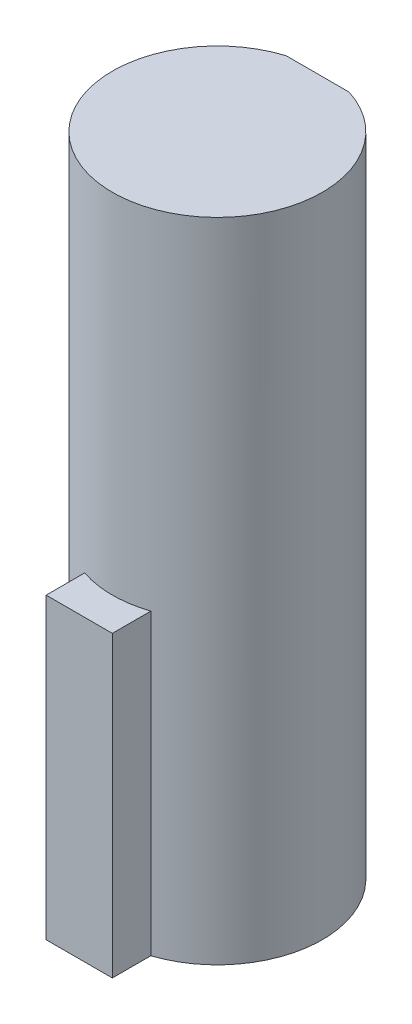
ISO-10303-21;
HEADER;
FILE_DESCRIPTION(('STEP AP214'),'2;1');
FILE_NAME('part.step','',(''),(''),'','','');
FILE_SCHEMA(('AUTOMOTIVE_DESIGN { 1 0 10303 214 1 1 1 1 }'));
ENDSEC;
DATA;
#1=APPLICATION_CONTEXT('core data for automotive mechanical design processes');
#2=APPLICATION_PROTOCOL_DEFINITION('international standard','automotive_design',2000,#1);
#3=PRODUCT_CONTEXT('',#1,'mechanical');
#4=PRODUCT('Part','Part','',(#3));
#5=PRODUCT_RELATED_PRODUCT_CATEGORY('part','',(#4));
#6=PRODUCT_DEFINITION_FORMATION('','',#4);
#7=PRODUCT_DEFINITION_CONTEXT('part definition',#1,'design');
#8=PRODUCT_DEFINITION('design','',#6,#7);
#9=PRODUCT_DEFINITION_SHAPE('','',#8);
#10=(LENGTH_UNIT() NAMED_UNIT(*) SI_UNIT(.MILLI.,.METRE.));
#11=(NAMED_UNIT(*) PLANE_ANGLE_UNIT() SI_UNIT($,.RADIAN.));
#12=(NAMED_UNIT(*) SI_UNIT($,.STERADIAN.) SOLID_ANGLE_UNIT());
#13=UNCERTAINTY_MEASURE_WITH_UNIT(LENGTH_MEASURE(1.E-05),#10,'distance_accuracy_value','');
#14=(GEOMETRIC_REPRESENTATION_CONTEXT(3) GLOBAL_UNCERTAINTY_ASSIGNED_CONTEXT((#13)) GLOBAL_UNIT_ASSIGNED_CONTEXT((#10,
#11,#12)) REPRESENTATION_CONTEXT('',''));
#15=CARTESIAN_POINT('',(0.,0.,0.));
#16=DIRECTION('',(0.,0.,1.));
#17=DIRECTION('',(1.,0.,0.));
#18=AXIS2_PLACEMENT_3D('',#15,#16,#17);
#19=CARTESIAN_POINT('',(2.3,20.75,0.));
#20=DIRECTION('',(1.,0.,0.));
#21=DIRECTION('',(0.,0.,-1.));
#22=AXIS2_PLACEMENT_3D('',#19,#20,#21);
#23=PLANE('',#22);
#24=DIRECTION('',(0.,0.,1.));
#25=VECTOR('',#24,1.);
#26=CARTESIAN_POINT('',(2.3,0.,0.));
#27=LINE('',#26,#25);
#28=CARTESIAN_POINT('',(2.3,0.,6.92820323027551));
#29=VERTEX_POINT('',#28);
#30=CARTESIAN_POINT('',(2.3,0.,9.60106781186547));
#31=VERTEX_POINT('',#30);
#32=EDGE_CURVE('E114',#29,#31,#27,.T.);
#33=ORIENTED_EDGE('',*,*,#32,.F.);
#34=DIRECTION('',(0.,-1.,0.));
#35=VECTOR('',#34,1.);
#36=CARTESIAN_POINT('',(2.3,20.75,6.92820323027551));
#37=LINE('',#36,#35);
#38=CARTESIAN_POINT('',(2.3,20.75,6.92820323027551));
#39=VERTEX_POINT('',#38);
#40=EDGE_CURVE('E121',#39,#29,#37,.T.);
#41=ORIENTED_EDGE('',*,*,#40,.F.);
#42=DIRECTION('',(0.,0.,1.));
#43=VECTOR('',#42,1.);
#44=CARTESIAN_POINT('',(2.3,20.75,0.));
#45=LINE('',#44,#43);
#46=CARTESIAN_POINT('',(2.3,20.75,9.60106781186547));
#47=VERTEX_POINT('',#46);
#48=EDGE_CURVE('E122',#39,#47,#45,.T.);
#49=ORIENTED_EDGE('',*,*,#48,.T.);
#50=DIRECTION('',(0.,-1.,0.));
#51=VECTOR('',#50,1.);
#52=CARTESIAN_POINT('',(2.3,20.75,9.60106781186547));
#53=LINE('',#52,#51);
#54=EDGE_CURVE('E65',#47,#31,#53,.T.);
#55=ORIENTED_EDGE('',*,*,#54,.T.);
#56=EDGE_LOOP('',(#33,#41,#49,#55));
#57=FACE_BOUND('',#56,.T.);
#58=ADVANCED_FACE('F43',(#57),#23,.T.);
#59=CARTESIAN_POINT('',(0.,20.75,0.));
#60=DIRECTION('',(0.,-1.,0.));
#61=DIRECTION('',(0.,0.,-1.));
#62=AXIS2_PLACEMENT_3D('',#59,#60,#61);
#63=CYLINDRICAL_SURFACE('',#62,7.3);
#64=CARTESIAN_POINT('',(0.,45.,0.));
#65=DIRECTION('',(0.,1.,0.));
#66=DIRECTION('',(0.,0.,1.));
#67=AXIS2_PLACEMENT_3D('',#64,#65,#66);
#68=CIRCLE('',#67,7.3);
#69=CARTESIAN_POINT('',(-2.18632111090755,45.,-6.96491205974634));
#70=VERTEX_POINT('',#69);
#71=CARTESIAN_POINT('',(2.18632111090755,45.,-6.96491205974634));
#72=VERTEX_POINT('',#71);
#73=EDGE_CURVE('E108',#70,#72,#68,.T.);
#74=ORIENTED_EDGE('',*,*,#73,.F.);
#75=DIRECTION('',(0.,-1.,0.));
#76=VECTOR('',#75,1.);
#77=CARTESIAN_POINT('',(-2.18632111090755,20.75,-6.96491205974634));
#78=LINE('',#77,#76);
#79=CARTESIAN_POINT('',(-2.18632111090755,0.,-6.96491205974634));
#80=VERTEX_POINT('',#79);
#81=EDGE_CURVE('E56',#70,#80,#78,.T.);
#82=ORIENTED_EDGE('',*,*,#81,.T.);
#83=CARTESIAN_POINT('',(0.,0.,0.));
#84=DIRECTION('',(0.,1.,0.));
#85=DIRECTION('',(0.,0.,1.));
#86=AXIS2_PLACEMENT_3D('',#83,#84,#85);
#87=CIRCLE('',#86,7.3);
#88=CARTESIAN_POINT('',(-2.30000000000001,0.,6.92820323027551));
#89=VERTEX_POINT('',#88);
#90=EDGE_CURVE('E116',#80,#89,#87,.T.);
#91=ORIENTED_EDGE('',*,*,#90,.T.);
#92=DIRECTION('',(0.,-1.,0.));
#93=VECTOR('',#92,1.);
#94=CARTESIAN_POINT('',(-2.30000000000001,20.75,6.92820323027551));
#95=LINE('',#94,#93);
#96=CARTESIAN_POINT('',(-2.30000000000001,20.75,6.92820323027551));
#97=VERTEX_POINT('',#96);
#98=EDGE_CURVE('E138',#97,#89,#95,.T.);
#99=ORIENTED_EDGE('',*,*,#98,.F.);
#100=CARTESIAN_POINT('',(0.,20.75,0.));
#101=DIRECTION('',(0.,1.,0.));
#102=DIRECTION('',(0.,0.,1.));
#103=AXIS2_PLACEMENT_3D('',#100,#101,#102);
#104=CIRCLE('',#103,7.3);
#105=EDGE_CURVE('E50',#97,#39,#104,.T.);
#106=ORIENTED_EDGE('',*,*,#105,.T.);
#107=ORIENTED_EDGE('',*,*,#40,.T.);
#108=CARTESIAN_POINT('',(2.18632111090755,0.,-6.96491205974634));
#109=VERTEX_POINT('',#108);
#110=EDGE_CURVE('E110',#29,#109,#87,.T.);
#111=ORIENTED_EDGE('',*,*,#110,.T.);
#112=DIRECTION('',(0.,-1.,0.));
#113=VECTOR('',#112,1.);
#114=CARTESIAN_POINT('',(2.18632111090755,20.75,-6.96491205974634));
#115=LINE('',#114,#113);
#116=EDGE_CURVE('E100',#109,#72,#115,.F.);
#117=ORIENTED_EDGE('',*,*,#116,.T.);
#118=EDGE_LOOP('',(#74,#82,#91,#99,#106,#107,#111,#117));
#119=FACE_BOUND('',#118,.T.);
#120=ADVANCED_FACE('F107',(#119),#63,.T.);
#121=CARTESIAN_POINT('',(-2.30000000000003,20.75,0.));
#122=DIRECTION('',(1.,0.,0.));
#123=DIRECTION('',(0.,0.,-1.));
#124=AXIS2_PLACEMENT_3D('',#121,#122,#123);
#125=PLANE('',#124);
#126=DIRECTION('',(0.,0.,1.));
#127=VECTOR('',#126,1.);
#128=CARTESIAN_POINT('',(-2.30000000000003,0.,0.));
#129=LINE('',#128,#127);
#130=CARTESIAN_POINT('',(-2.3,0.,9.60106781186547));
#131=VERTEX_POINT('',#130);
#132=EDGE_CURVE('E130',#89,#131,#129,.T.);
#133=ORIENTED_EDGE('',*,*,#132,.T.);
#134=DIRECTION('',(0.,-1.,0.));
#135=VECTOR('',#134,1.);
#136=CARTESIAN_POINT('',(-2.3,20.75,9.60106781186547));
#137=LINE('',#136,#135);
#138=CARTESIAN_POINT('',(-2.3,20.75,9.60106781186547));
#139=VERTEX_POINT('',#138);
#140=EDGE_CURVE('E136',#139,#131,#137,.T.);
#141=ORIENTED_EDGE('',*,*,#140,.F.);
#142=DIRECTION('',(0.,0.,1.));
#143=VECTOR('',#142,1.);
#144=CARTESIAN_POINT('',(-2.30000000000003,20.75,0.));
#145=LINE('',#144,#143);
#146=EDGE_CURVE('E124',#97,#139,#145,.T.);
#147=ORIENTED_EDGE('',*,*,#146,.F.);
#148=ORIENTED_EDGE('',*,*,#98,.T.);
#149=EDGE_LOOP('',(#133,#141,#147,#148));
#150=FACE_BOUND('',#149,.T.);
#151=ADVANCED_FACE('F149',(#150),#125,.F.);
#152=CARTESIAN_POINT('',(0.,20.75,9.60106781186547));
#153=DIRECTION('',(0.,0.,1.));
#154=DIRECTION('',(1.,0.,0.));
#155=AXIS2_PLACEMENT_3D('',#152,#153,#154);
#156=PLANE('',#155);
#157=DIRECTION('',(-1.,0.,0.));
#158=VECTOR('',#157,1.);
#159=CARTESIAN_POINT('',(0.,0.,9.60106781186547));
#160=LINE('',#159,#158);
#161=EDGE_CURVE('E125',#31,#131,#160,.T.);
#162=ORIENTED_EDGE('',*,*,#161,.F.);
#163=ORIENTED_EDGE('',*,*,#54,.F.);
#164=DIRECTION('',(-1.,0.,0.));
#165=VECTOR('',#164,1.);
#166=CARTESIAN_POINT('',(0.,20.75,9.60106781186547));
#167=LINE('',#166,#165);
#168=EDGE_CURVE('E127',#47,#139,#167,.T.);
#169=ORIENTED_EDGE('',*,*,#168,.T.);
#170=ORIENTED_EDGE('',*,*,#140,.T.);
#171=EDGE_LOOP('',(#162,#163,#169,#170));
#172=FACE_BOUND('',#171,.T.);
#173=ADVANCED_FACE('F155',(#172),#156,.T.);
#174=CARTESIAN_POINT('',(0.,20.75,0.));
#175=DIRECTION('',(0.,1.,0.));
#176=DIRECTION('',(0.,0.,1.));
#177=AXIS2_PLACEMENT_3D('',#174,#175,#176);
#178=PLANE('',#177);
#179=ORIENTED_EDGE('',*,*,#105,.F.);
#180=ORIENTED_EDGE('',*,*,#146,.T.);
#181=ORIENTED_EDGE('',*,*,#168,.F.);
#182=ORIENTED_EDGE('',*,*,#48,.F.);
#183=EDGE_LOOP('',(#179,#180,#181,#182));
#184=FACE_BOUND('',#183,.T.);
#185=ADVANCED_FACE('F160',(#184),#178,.T.);
#186=CARTESIAN_POINT('',(0.,0.,0.));
#187=DIRECTION('',(0.,1.,0.));
#188=DIRECTION('',(0.,0.,1.));
#189=AXIS2_PLACEMENT_3D('',#186,#187,#188);
#190=PLANE('',#189);
#191=ORIENTED_EDGE('',*,*,#90,.F.);
#192=DIRECTION('',(1.,0.,0.));
#193=VECTOR('',#192,1.);
#194=CARTESIAN_POINT('',(0.,0.,-6.96491205974634));
#195=LINE('',#194,#193);
#196=EDGE_CURVE('E111',#80,#109,#195,.T.);
#197=ORIENTED_EDGE('',*,*,#196,.T.);
#198=ORIENTED_EDGE('',*,*,#110,.F.);
#199=ORIENTED_EDGE('',*,*,#32,.T.);
#200=ORIENTED_EDGE('',*,*,#161,.T.);
#201=ORIENTED_EDGE('',*,*,#132,.F.);
#202=EDGE_LOOP('',(#191,#197,#198,#199,#200,#201));
#203=FACE_BOUND('',#202,.T.);
#204=ADVANCED_FACE('F143',(#203),#190,.F.);
#205=CARTESIAN_POINT('',(0.,45.,0.));
#206=DIRECTION('',(0.,1.,0.));
#207=DIRECTION('',(0.,0.,1.));
#208=AXIS2_PLACEMENT_3D('',#205,#206,#207);
#209=PLANE('',#208);
#210=DIRECTION('',(1.,0.,0.));
#211=VECTOR('',#210,1.);
#212=CARTESIAN_POINT('',(0.,45.,-6.96491205974634));
#213=LINE('',#212,#211);
#214=EDGE_CURVE('E11',#70,#72,#213,.T.);
#215=ORIENTED_EDGE('',*,*,#214,.F.);
#216=ORIENTED_EDGE('',*,*,#73,.T.);
#217=EDGE_LOOP('',(#215,#216));
#218=FACE_BOUND('',#217,.T.);
#219=ADVANCED_FACE('F113',(#218),#209,.T.);
#220=CARTESIAN_POINT('',(-2.5,-5.,-6.96491205974634));
#221=DIRECTION('',(0.,0.,1.));
#222=DIRECTION('',(1.,0.,0.));
#223=AXIS2_PLACEMENT_3D('',#220,#221,#222);
#224=PLANE('',#223);
#225=ORIENTED_EDGE('',*,*,#214,.T.);
#226=ORIENTED_EDGE('',*,*,#116,.F.);
#227=ORIENTED_EDGE('',*,*,#196,.F.);
#228=ORIENTED_EDGE('',*,*,#81,.F.);
#229=EDGE_LOOP('',(#225,#226,#227,#228));
#230=FACE_BOUND('',#229,.T.);
#231=ADVANCED_FACE('F99',(#230),#224,.F.);
#232=CLOSED_SHELL('',(#58,#120,#151,#173,#185,#204,#219,#231));
#233=MANIFOLD_SOLID_BREP('B2',#232);
#234=ADVANCED_BREP_SHAPE_REPRESENTATION('',(#18,#233),#14);
#235=SHAPE_DEFINITION_REPRESENTATION(#9,#234);
ENDSEC;
END-ISO-10303-21;
